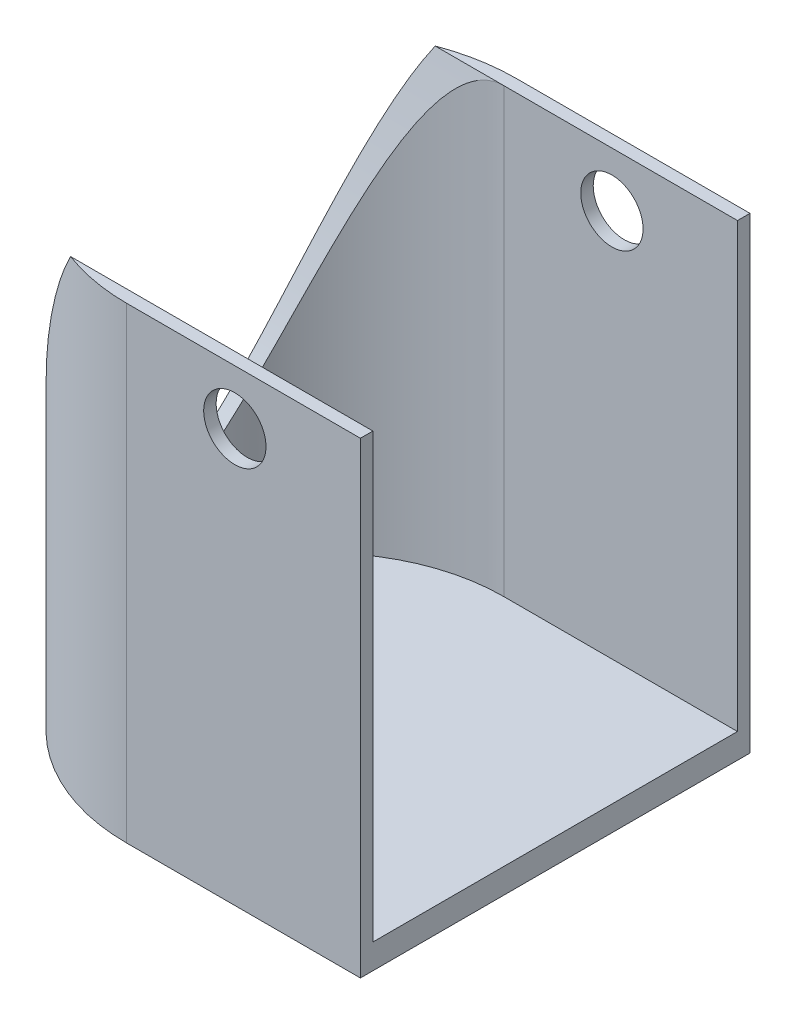
ISO-10303-21;
HEADER;
FILE_DESCRIPTION(('STEP AP214'),'2;1');
FILE_NAME('part.step','',(''),(''),'','','');
FILE_SCHEMA(('AUTOMOTIVE_DESIGN { 1 0 10303 214 1 1 1 1 }'));
ENDSEC;
DATA;
#1=APPLICATION_CONTEXT('core data for automotive mechanical design processes');
#2=APPLICATION_PROTOCOL_DEFINITION('international standard','automotive_design',2000,#1);
#3=PRODUCT_CONTEXT('',#1,'mechanical');
#4=PRODUCT('Part','Part','',(#3));
#5=PRODUCT_RELATED_PRODUCT_CATEGORY('part','',(#4));
#6=PRODUCT_DEFINITION_FORMATION('','',#4);
#7=PRODUCT_DEFINITION_CONTEXT('part definition',#1,'design');
#8=PRODUCT_DEFINITION('design','',#6,#7);
#9=PRODUCT_DEFINITION_SHAPE('','',#8);
#10=(LENGTH_UNIT() NAMED_UNIT(*) SI_UNIT(.MILLI.,.METRE.));
#11=(NAMED_UNIT(*) PLANE_ANGLE_UNIT() SI_UNIT($,.RADIAN.));
#12=(NAMED_UNIT(*) SI_UNIT($,.STERADIAN.) SOLID_ANGLE_UNIT());
#13=UNCERTAINTY_MEASURE_WITH_UNIT(LENGTH_MEASURE(1.E-05),#10,'distance_accuracy_value','');
#14=(GEOMETRIC_REPRESENTATION_CONTEXT(3) GLOBAL_UNCERTAINTY_ASSIGNED_CONTEXT((#13)) GLOBAL_UNIT_ASSIGNED_CONTEXT((#10,
#11,#12)) REPRESENTATION_CONTEXT('',''));
#15=CARTESIAN_POINT('',(0.,0.,0.));
#16=DIRECTION('',(0.,0.,1.));
#17=DIRECTION('',(1.,0.,0.));
#18=AXIS2_PLACEMENT_3D('',#15,#16,#17);
#19=CARTESIAN_POINT('',(0.,30.,0.));
#20=DIRECTION('',(0.,1.,0.));
#21=DIRECTION('',(0.,0.,1.));
#22=AXIS2_PLACEMENT_3D('',#19,#20,#21);
#23=PLANE('',#22);
#24=DIRECTION('',(1.,0.,0.));
#25=VECTOR('',#24,1.);
#26=CARTESIAN_POINT('',(-12.501,30.,11.7));
#27=LINE('',#26,#25);
#28=CARTESIAN_POINT('',(-4.40000000000001,30.,11.7));
#29=VERTEX_POINT('',#28);
#30=CARTESIAN_POINT('',(0.,30.,11.7));
#31=VERTEX_POINT('',#30);
#32=EDGE_CURVE('E111',#29,#31,#27,.T.);
#33=ORIENTED_EDGE('',*,*,#32,.F.);
#34=CARTESIAN_POINT('',(0.,30.,0.));
#35=DIRECTION('',(0.,1.,0.));
#36=DIRECTION('',(0.,0.,1.));
#37=AXIS2_PLACEMENT_3D('',#34,#35,#36);
#38=CIRCLE('',#37,12.5);
#39=CARTESIAN_POINT('',(0.,30.,12.5));
#40=VERTEX_POINT('',#39);
#41=EDGE_CURVE('E107',#29,#40,#38,.T.);
#42=ORIENTED_EDGE('',*,*,#41,.T.);
#43=DIRECTION('',(-1.,0.,0.));
#44=VECTOR('',#43,1.);
#45=CARTESIAN_POINT('',(0.,30.,12.5));
#46=LINE('',#45,#44);
#47=CARTESIAN_POINT('',(15.,30.,12.5));
#48=VERTEX_POINT('',#47);
#49=EDGE_CURVE('E108',#48,#40,#46,.T.);
#50=ORIENTED_EDGE('',*,*,#49,.F.);
#51=DIRECTION('',(0.,0.,1.));
#52=VECTOR('',#51,1.);
#53=CARTESIAN_POINT('',(15.,30.,0.));
#54=LINE('',#53,#52);
#55=CARTESIAN_POINT('',(15.,30.,11.7));
#56=VERTEX_POINT('',#55);
#57=EDGE_CURVE('E127',#56,#48,#54,.T.);
#58=ORIENTED_EDGE('',*,*,#57,.F.);
#59=DIRECTION('',(1.,0.,0.));
#60=VECTOR('',#59,1.);
#61=CARTESIAN_POINT('',(0.,30.,11.7));
#62=LINE('',#61,#60);
#63=EDGE_CURVE('E131',#31,#56,#62,.T.);
#64=ORIENTED_EDGE('',*,*,#63,.F.);
#65=EDGE_LOOP('',(#33,#42,#50,#58,#64));
#66=FACE_BOUND('',#65,.T.);
#67=ADVANCED_FACE('F40',(#66),#23,.T.);
#68=CARTESIAN_POINT('',(0.,30.,0.));
#69=DIRECTION('',(0.,-1.,0.));
#70=DIRECTION('',(0.,0.,-1.));
#71=AXIS2_PLACEMENT_3D('',#68,#69,#70);
#72=CYLINDRICAL_SURFACE('',#71,11.7);
#73=CARTESIAN_POINT('',(0.,30.,-11.7));
#74=CARTESIAN_POINT('',(-0.049258101375061,30.0000032096415,-11.7000007196841));
#75=CARTESIAN_POINT('',(-0.0985059813434851,29.9986855820141,-11.6996887822882));
#76=CARTESIAN_POINT('',(-0.196846843223026,29.9934421558597,-11.6984471842786));
#77=CARTESIAN_POINT('',(-0.24593984974552,29.9895167951369,-11.6975176273551));
#78=CARTESIAN_POINT('',(-0.392554818632999,29.9739058264299,-11.6938201805136));
#79=CARTESIAN_POINT('',(-0.489670518131584,29.9583849672015,-11.6901434315138));
#80=CARTESIAN_POINT('',(-0.679950835991783,29.9181605011221,-11.6806072739594));
#81=CARTESIAN_POINT('',(-0.773155288915134,29.893631481338,-11.6747893590142));
#82=CARTESIAN_POINT('',(-0.956861779373848,29.8362725712588,-11.6611708944151));
#83=CARTESIAN_POINT('',(-1.04736215867759,29.8034376997824,-11.6533691550083));
#84=CARTESIAN_POINT('',(-1.24723487337645,29.7214568430444,-11.6338658775857));
#85=CARTESIAN_POINT('',(-1.35572616487419,29.6702851833034,-11.6216770335838));
#86=CARTESIAN_POINT('',(-1.56745253786004,29.5585840614918,-11.595020110473));
#87=CARTESIAN_POINT('',(-1.67068615382116,29.4980520090736,-11.5805514004244));
#88=CARTESIAN_POINT('',(-1.87268693721836,29.3688928670614,-11.5496130545393));
#89=CARTESIAN_POINT('',(-1.97141579867646,29.3002096687218,-11.533129523238));
#90=CARTESIAN_POINT('',(-2.16386586291147,29.1565716069899,-11.4985757019352));
#91=CARTESIAN_POINT('',(-2.25758721748206,29.0816169338832,-11.480505460076));
#92=CARTESIAN_POINT('',(-2.43667951562796,28.9297596587419,-11.4438020372105));
#93=CARTESIAN_POINT('',(-2.52223509342245,28.8530607340774,-11.42522176038));
#94=CARTESIAN_POINT('',(-2.68945386294756,28.6957645413899,-11.3870183361033));
#95=CARTESIAN_POINT('',(-2.77111621341549,28.6151664383307,-11.3673949651816));
#96=CARTESIAN_POINT('',(-3.01088771838486,28.3684258353654,-11.3071567811458));
#97=CARTESIAN_POINT('',(-3.16367515839669,28.1974295051622,-11.2651962090944));
#98=CARTESIAN_POINT('',(-3.45759940293745,27.8461678123477,-11.1784827034435));
#99=CARTESIAN_POINT('',(-3.59872196918005,27.6658915454844,-11.1337264710326));
#100=CARTESIAN_POINT('',(-3.87105257915507,27.2987280974535,-11.0419915153588));
#101=CARTESIAN_POINT('',(-4.00226552206157,27.111844250966,-10.99501390924));
#102=CARTESIAN_POINT('',(-4.24636675041821,26.7479840105599,-10.9029353840585));
#103=CARTESIAN_POINT('',(-4.35988395533909,26.5713898674332,-10.857978997491));
#104=CARTESIAN_POINT('',(-4.58085936151995,26.2148026735703,-10.7666160032948));
#105=CARTESIAN_POINT('',(-4.68831690346248,26.0348092558118,-10.7202092387092));
#106=CARTESIAN_POINT('',(-4.89807040969365,25.6718934099229,-10.6260124012262));
#107=CARTESIAN_POINT('',(-5.00035981577591,25.4889676299519,-10.5782206861051));
#108=CARTESIAN_POINT('',(-5.20027244128587,25.1209051704081,-10.4813876093092));
#109=CARTESIAN_POINT('',(-5.29789539286179,24.9357683646842,-10.4323461761485));
#110=CARTESIAN_POINT('',(-5.58486268304371,24.3771000226047,-10.2832843701603));
#111=CARTESIAN_POINT('',(-5.76799734103882,24.0008520005404,-10.1814667251662));
#112=CARTESIAN_POINT('',(-6.12099546442225,23.2433562094264,-9.97323123906766));
#113=CARTESIAN_POINT('',(-6.29085501098016,22.8621070025187,-9.86681205387523));
#114=CARTESIAN_POINT('',(-6.62017024833715,22.0947441124164,-9.64896175256481));
#115=CARTESIAN_POINT('',(-6.77958401804471,21.7086174606204,-9.53751315164774));
#116=CARTESIAN_POINT('',(-7.08883568455921,20.9345191389043,-9.3099517985175));
#117=CARTESIAN_POINT('',(-7.2386851374114,20.5465503282807,-9.19384496198414));
#118=CARTESIAN_POINT('',(-7.53023621352857,19.7693820390032,-8.95660853508552));
#119=CARTESIAN_POINT('',(-7.67194264355999,19.3801834324663,-8.83548198204322));
#120=CARTESIAN_POINT('',(-7.94829091353698,18.6010828379043,-8.5877296513818));
#121=CARTESIAN_POINT('',(-8.08293348929008,18.2111809275329,-8.46110444905181));
#122=CARTESIAN_POINT('',(-8.35038890203282,17.4181185727428,-8.1974055179718));
#123=CARTESIAN_POINT('',(-8.48298656385961,17.0149548414438,-8.06012337587082));
#124=CARTESIAN_POINT('',(-8.74218586861357,16.2091222281368,-7.77822990581555));
#125=CARTESIAN_POINT('',(-8.86878582998974,15.8064535153777,-7.63361654568778));
#126=CARTESIAN_POINT('',(-9.11649011376761,15.0023763540498,-7.3360143526935));
#127=CARTESIAN_POINT('',(-9.23759287465805,14.6009682933444,-7.18302316695098));
#128=CARTESIAN_POINT('',(-9.47446179073551,13.8009841668016,-6.86756437349363));
#129=CARTESIAN_POINT('',(-9.59023510885834,13.4024049472532,-6.70511019209105));
#130=CARTESIAN_POINT('',(-9.81681100047771,12.6087686979649,-6.36877833837085));
#131=CARTESIAN_POINT('',(-9.92761474456836,12.2137108565112,-6.19490338027734));
#132=CARTESIAN_POINT('',(-10.1442936359354,11.4287378924248,-5.83333397657197));
#133=CARTESIAN_POINT('',(-10.250170683847,11.0388208288773,-5.64564493356475));
#134=CARTESIAN_POINT('',(-10.431393656897,10.3615256462058,-5.30131447028419));
#135=CARTESIAN_POINT('',(-10.5078369197916,10.0725442761388,-5.1484107529375));
#136=CARTESIAN_POINT('',(-10.657659635622,9.50020419245309,-4.83065511595258));
#137=CARTESIAN_POINT('',(-10.7310380503971,9.2168474008406,-4.66579919863674));
#138=CARTESIAN_POINT('',(-10.8383619742498,8.7983397017282,-4.40777846867556));
#139=CARTESIAN_POINT('',(-10.8736289768821,8.66012551701851,-4.320120206107));
#140=CARTESIAN_POINT('',(-10.9432086893224,8.38614344205187,-4.14070683655348));
#141=CARTESIAN_POINT('',(-10.977521477517,8.25037535117805,-4.04895206771083));
#142=CARTESIAN_POINT('',(-11.0450704312391,7.98188127151324,-3.86088014450412));
#143=CARTESIAN_POINT('',(-11.0783072342264,7.8491534956639,-3.7645657779291));
#144=CARTESIAN_POINT('',(-11.1435800333868,7.58735877432487,-3.56671830245641));
#145=CARTESIAN_POINT('',(-11.1756162468655,7.4582911673873,-3.46518614593951));
#146=CARTESIAN_POINT('',(-11.2306276426555,7.23574642945223,-3.28173550481671));
#147=CARTESIAN_POINT('',(-11.2539017651121,7.14128874290048,-3.2010972285925));
#148=CARTESIAN_POINT('',(-11.2995459699265,6.95548859794716,-3.03604917524168));
#149=CARTESIAN_POINT('',(-11.3219160562565,6.86414612585846,-2.9516394146894));
#150=CARTESIAN_POINT('',(-11.3656570575082,6.68503473178586,-2.77845886083546));
#151=CARTESIAN_POINT('',(-11.3870257315241,6.59727387635499,-2.68967912063535));
#152=CARTESIAN_POINT('',(-11.4285282301928,6.42636971224671,-2.50748331861749));
#153=CARTESIAN_POINT('',(-11.4486620598057,6.34322638502207,-2.41406727542525));
#154=CARTESIAN_POINT('',(-11.4877078309611,6.18158917615351,-2.22090175027632));
#155=CARTESIAN_POINT('',(-11.5066005910373,6.10316937607054,-2.12108595789139));
#156=CARTESIAN_POINT('',(-11.5425595899119,5.95357682934364,-1.91577110572283));
#157=CARTESIAN_POINT('',(-11.5596254448091,5.88240560604923,-1.81027085839701));
#158=CARTESIAN_POINT('',(-11.5914670569171,5.74935564413245,-1.59368509182712));
#159=CARTESIAN_POINT('',(-11.6062503426427,5.68744637907462,-1.48261960671381));
#160=CARTESIAN_POINT('',(-11.6330997473687,5.57482897509669,-1.25464315762301));
#161=CARTESIAN_POINT('',(-11.6451680629683,5.52411178165185,-1.13773701342089));
#162=CARTESIAN_POINT('',(-11.6621306780571,5.45274354300543,-0.943572077344231));
#163=CARTESIAN_POINT('',(-11.6680171765049,5.42795383250219,-0.86790971874309));
#164=CARTESIAN_POINT('',(-11.6783945768847,5.38422621773212,-0.714827860662595));
#165=CARTESIAN_POINT('',(-11.6828859463492,5.36528635309056,-0.637408959184661));
#166=CARTESIAN_POINT('',(-11.6903580181322,5.33376484284114,-0.481280713220115));
#167=CARTESIAN_POINT('',(-11.6933400817223,5.32117746783182,-0.402572597894574));
#168=CARTESIAN_POINT('',(-11.6977164716923,5.30270126484983,-0.244322536513957));
#169=CARTESIAN_POINT('',(-11.6991107769746,5.29681252588567,-0.164780579393334));
#170=CARTESIAN_POINT('',(-11.700271534706,5.29191030773773,-0.00524142583990026));
#171=CARTESIAN_POINT('',(-11.7000332768325,5.2929167226681,0.0747564219071852));
#172=CARTESIAN_POINT('',(-11.6979251499843,5.30181941745877,0.234341389358526));
#173=CARTESIAN_POINT('',(-11.6960553066526,5.30971558903559,0.313928515498149));
#174=CARTESIAN_POINT('',(-11.6907374097818,5.33216254806434,0.472154458845774));
#175=CARTESIAN_POINT('',(-11.6872882761399,5.34671788982755,0.550792589180831));
#176=CARTESIAN_POINT('',(-11.6789045225227,5.38207472582118,0.706599195949387));
#177=CARTESIAN_POINT('',(-11.6739691324941,5.40287945794697,0.783766888434809));
#178=CARTESIAN_POINT('',(-11.6611043399576,5.45706576438037,0.958310748303037));
#179=CARTESIAN_POINT('',(-11.6527217844705,5.49234477275533,1.05506573778316));
#180=CARTESIAN_POINT('',(-11.6339673803353,5.57116868060561,1.24495768691491));
#181=CARTESIAN_POINT('',(-11.6235945465596,5.61471767336269,1.33809282728237));
#182=CARTESIAN_POINT('',(-11.601123443178,5.70891144220395,1.52066115453911));
#183=CARTESIAN_POINT('',(-11.5890222894493,5.75956807658215,1.61008782444147));
#184=CARTESIAN_POINT('',(-11.5633631649667,5.86679043998052,1.78506280119763));
#185=CARTESIAN_POINT('',(-11.5498053063613,5.92335571409826,1.87061140589507));
#186=CARTESIAN_POINT('',(-11.5104672717437,6.08716148907908,2.10282238760349));
#187=CARTESIAN_POINT('',(-11.4833523222947,6.19972461850636,2.24551138751755));
#188=CARTESIAN_POINT('',(-11.4261507462943,6.43624717575431,2.52047950279845));
#189=CARTESIAN_POINT('',(-11.3960615518666,6.56021644480067,2.65274944248283));
#190=CARTESIAN_POINT('',(-11.3334849644712,6.81693169282609,2.90851976753572));
#191=CARTESIAN_POINT('',(-11.3009914629996,6.94969993104013,3.03199613449709));
#192=CARTESIAN_POINT('',(-11.2341397383921,7.22160672467123,3.27100804932282));
#193=CARTESIAN_POINT('',(-11.1997822502445,7.36074276586433,3.38654668696526));
#194=CARTESIAN_POINT('',(-11.1360015336267,7.61778938533407,3.59007424501468));
#195=CARTESIAN_POINT('',(-11.1068409351137,7.73486636540307,3.679206368055));
#196=CARTESIAN_POINT('',(-11.0475976965937,7.97175661546727,3.85344581519432));
#197=CARTESIAN_POINT('',(-11.0175149795787,8.09157011378059,3.93855280162837));
#198=CARTESIAN_POINT('',(-10.9259603122042,8.45467863928166,4.18867744687654));
#199=CARTESIAN_POINT('',(-10.8632456780835,8.7013840661726,4.34829852262194));
#200=CARTESIAN_POINT('',(-10.7349342636131,9.20157174127461,4.65606836864015));
#201=CARTESIAN_POINT('',(-10.6693332855075,9.45506363468299,4.80419950189019));
#202=CARTESIAN_POINT('',(-10.5356044072976,9.96687500824878,5.09077990391465));
#203=CARTESIAN_POINT('',(-10.4674758725367,10.2251956927013,5.22922671547818));
#204=CARTESIAN_POINT('',(-10.3284994779328,10.7468416360025,5.49865330693726));
#205=CARTESIAN_POINT('',(-10.2576388395073,11.0101864768967,5.62958836167974));
#206=CARTESIAN_POINT('',(-10.1137194531307,11.5393439411996,5.88421906068544));
#207=CARTESIAN_POINT('',(-10.0406633876232,11.8051532989907,6.00792303585696));
#208=CARTESIAN_POINT('',(-9.8923409960964,12.3387659184069,6.24912947482098));
#209=CARTESIAN_POINT('',(-9.81707590092932,12.6065680098533,6.36663529377576));
#210=CARTESIAN_POINT('',(-9.66428964517458,13.1437862252259,6.59625005095989));
#211=CARTESIAN_POINT('',(-9.58676878849577,13.413202127882,6.70835971083789));
#212=CARTESIAN_POINT('',(-9.4269932970419,13.9615817940221,6.93117359382533));
#213=CARTESIAN_POINT('',(-9.34466639758636,14.2405848459802,7.04172911560225));
#214=CARTESIAN_POINT('',(-9.17745197127813,14.7995825582558,7.25831043432132));
#215=CARTESIAN_POINT('',(-9.09256438363781,15.079577241974,7.3643361235861));
#216=CARTESIAN_POINT('',(-8.83379601813817,15.9208629874757,7.67640984754736));
#217=CARTESIAN_POINT('',(-8.65588565316495,16.4831935061923,7.87634912995903));
#218=CARTESIAN_POINT('',(-8.28782902928587,17.6087668788896,8.26275037122836));
#219=CARTESIAN_POINT('',(-8.09767723112137,18.1720100318567,8.44920614660237));
#220=CARTESIAN_POINT('',(-7.70417866660093,19.2942391867715,8.80945403930699));
#221=CARTESIAN_POINT('',(-7.50090879127024,19.8532317419639,8.98330916854054));
#222=CARTESIAN_POINT('',(-7.18323088357998,20.6890697215017,9.23631053299985));
#223=CARTESIAN_POINT('',(-7.07523056064209,20.967189362029,9.31933279209121));
#224=CARTESIAN_POINT('',(-6.85445439951712,21.5222568294438,9.48289784446998));
#225=CARTESIAN_POINT('',(-6.74167868979394,21.7992046876335,9.5634407043558));
#226=CARTESIAN_POINT('',(-6.51080956350313,22.3514200220284,9.72208638472129));
#227=CARTESIAN_POINT('',(-6.39271864764165,22.6266882206694,9.8001903239686));
#228=CARTESIAN_POINT('',(-6.15043836038742,23.175186294546,9.95402978907956));
#229=CARTESIAN_POINT('',(-6.02624931369776,23.4484162774186,10.0297654406951));
#230=CARTESIAN_POINT('',(-5.7943957513665,23.9420823796381,10.1651125666011));
#231=CARTESIAN_POINT('',(-5.68790781051858,24.1629615513849,10.2251217283439));
#232=CARTESIAN_POINT('',(-5.46962580131675,24.60253968615,10.3435302377273));
#233=CARTESIAN_POINT('',(-5.3578315036511,24.8212385544523,10.4019295156248));
#234=CARTESIAN_POINT('',(-5.12785104289169,25.2564991534525,10.5172115202566));
#235=CARTESIAN_POINT('',(-5.00964769252403,25.4730530882379,10.5740894894756));
#236=CARTESIAN_POINT('',(-4.76618302284153,25.9026313674325,10.6860406564638));
#237=CARTESIAN_POINT('',(-4.64092226004046,26.115655988437,10.7411139959972));
#238=CARTESIAN_POINT('',(-4.41923027346935,26.4766853486969,10.8337617937533));
#239=CARTESIAN_POINT('',(-4.32483493521446,26.6258143246829,10.8718245982215));
#240=CARTESIAN_POINT('',(-4.13125980836975,26.9212553844865,10.9468477190659));
#241=CARTESIAN_POINT('',(-4.03207946250393,27.0675671374123,10.9838079062127));
#242=CARTESIAN_POINT('',(-3.82822461016261,27.3567766642691,11.0565101471342));
#243=CARTESIAN_POINT('',(-3.72354678567304,27.4996722989027,11.0922514432762));
#244=CARTESIAN_POINT('',(-3.50833308884625,27.7805700463197,11.1621843754375));
#245=CARTESIAN_POINT('',(-3.39781915196535,27.9185876244501,11.196381026979));
#246=CARTESIAN_POINT('',(-3.16970794027035,28.1889803319749,11.2630844139328));
#247=CARTESIAN_POINT('',(-3.05211407173584,28.3213581232406,11.2955919482036));
#248=CARTESIAN_POINT('',(-2.80878501631485,28.5787554612646,11.3585436979105));
#249=CARTESIAN_POINT('',(-2.68305842282783,28.7037825167747,11.388990023857));
#250=CARTESIAN_POINT('',(-2.47381549425576,28.8965760765342,11.4357657449421));
#251=CARTESIAN_POINT('',(-2.39330409948314,28.9674084141138,11.4529102310276));
#252=CARTESIAN_POINT('',(-2.22852694413615,29.1048650586511,11.4861106243779));
#253=CARTESIAN_POINT('',(-2.14426103003526,29.1714891932607,11.5021664870598));
#254=CARTESIAN_POINT('',(-1.97170751707679,29.2996730917239,11.5329979994328));
#255=CARTESIAN_POINT('',(-1.88342006873105,29.3612330448702,11.547773696976));
#256=CARTESIAN_POINT('',(-1.70268446624892,29.4782187520015,11.5758041892066));
#257=CARTESIAN_POINT('',(-1.61023712235287,29.5336456933264,11.5890592782994));
#258=CARTESIAN_POINT('',(-1.35845366006451,29.6713713475091,11.6219463807737));
#259=CARTESIAN_POINT('',(-1.19522506768869,29.7472748423994,11.6400164634366));
#260=CARTESIAN_POINT('',(-0.942794837172334,29.840848709109,11.6622583577748));
#261=CARTESIAN_POINT('',(-0.857485855105807,29.8686401068847,11.6688571421114));
#262=CARTESIAN_POINT('',(-0.684678705473645,29.9167356736402,11.6802697896951));
#263=CARTESIAN_POINT('',(-0.597181741676468,29.937043866937,11.6850846123287));
#264=CARTESIAN_POINT('',(-0.425147171244462,29.9686393104845,11.6925728025152));
#265=CARTESIAN_POINT('',(-0.340689659647246,29.9803377778082,11.6953438038468));
#266=CARTESIAN_POINT('',(-0.170832762878414,29.9960494988495,11.6990646122625));
#267=CARTESIAN_POINT('',(-0.0854316676309858,30.00004514655,11.7000102471884));
#268=CARTESIAN_POINT('',(0.,30.,11.7));
#269=B_SPLINE_CURVE_WITH_KNOTS('',3,(#73,#74,#75,#76,#77,#78,#79,#80,#81,#82,#83,#84,#85,#86,
#87,#88,#89,#90,#91,#92,#93,#94,#95,#96,#97,#98,#99,#100,#101,#102,#103,#104,#105,#106,#107,
#108,#109,#110,#111,#112,#113,#114,#115,#116,#117,#118,#119,#120,#121,#122,#123,#124,#125,#126,
#127,#128,#129,#130,#131,#132,#133,#134,#135,#136,#137,#138,#139,#140,#141,#142,#143,#144,#145,
#146,#147,#148,#149,#150,#151,#152,#153,#154,#155,#156,#157,#158,#159,#160,#161,#162,#163,#164,
#165,#166,#167,#168,#169,#170,#171,#172,#173,#174,#175,#176,#177,#178,#179,#180,#181,#182,#183,
#184,#185,#186,#187,#188,#189,#190,#191,#192,#193,#194,#195,#196,#197,#198,#199,#200,#201,#202,
#203,#204,#205,#206,#207,#208,#209,#210,#211,#212,#213,#214,#215,#216,#217,#218,#219,#220,#221,
#222,#223,#224,#225,#226,#227,#228,#229,#230,#231,#232,#233,#234,#235,#236,#237,#238,#239,#240,
#241,#242,#243,#244,#245,#246,#247,#248,#249,#250,#251,#252,#253,#254,#255,#256,#257,#258,#259,
#260,#261,#262,#263,#264,#265,#266,#267,#268),.UNSPECIFIED.,.F.,.F.,(4,2,2,2,2,2,2,2,2,2,2,2,2,
2,2,2,2,2,2,2,2,2,2,2,2,2,2,2,2,2,2,2,2,2,2,2,2,2,2,2,2,2,2,2,2,2,2,2,2,2,2,2,2,2,2,2,2,2,2,2,2,
2,2,2,2,2,2,2,2,2,2,2,2,2,2,2,2,2,2,2,2,2,2,2,2,2,2,2,2,2,2,2,2,2,2,2,2,4),(0.,
0.147735930793361,0.295447064933373,0.590100099751862,0.879320349173426,1.16871446255305,
1.52982437254887,1.89103439370007,2.25489330933854,2.61874118897418,2.96776984030671,
3.31687357231839,4.01550716530005,4.71498129916086,5.41410732814498,6.05805241163673,
6.7020674244779,7.34688014071011,7.9917298244831,9.28334307701459,10.5753361864835,
11.8722315410463,13.1675290454141,14.4620539203642,15.756443682094,17.0945256385947,
18.4329805540686,19.7718133161346,21.1087907134766,22.4454515108537,23.7815922980353,
24.788667231705,25.7960805717865,26.2982975817835,26.8004732131102,27.3023456770809,
27.8041268595494,28.1831201464066,28.5621117678885,28.9419145121045,29.3217157306549,
29.7064313489694,30.0912276524,30.4747263606356,30.8579136668904,31.0972124006623,
31.3364308544635,31.5754331663949,31.8144386540464,32.0541340176342,32.2938256140959,
32.5336813850323,32.7736616435348,33.0831562525449,33.3928044490543,33.7029755410638,
34.0131227707745,34.5634340289459,35.1142246300775,35.6664661136153,36.2184914035617,
36.6684216198753,37.1183895137069,38.0193211349545,38.9216093861973,39.8241257515199,
40.7315525462365,41.6379124110573,42.5437765046646,43.4495191151364,44.3830562412301,
45.3166155458382,47.1846117629917,49.0534592735324,50.9122035650255,51.8412320114178,
52.7702354816362,53.6988063506305,54.6273278301352,55.3846028841931,56.1419106933866,
56.9013608479119,57.6607511994218,58.2023313039102,58.7439746353826,59.2859487202065,
59.82601356658,60.3658206230523,60.9050663291821,61.2307306863929,61.5564083726299,
61.8820738798997,62.2076762281967,62.7480819233747,63.0176863074101,63.2871454912861,
63.5427080438606,63.7988540358683),.UNSPECIFIED.);
#270=CARTESIAN_POINT('',(0.,30.,-11.7));
#271=VERTEX_POINT('',#270);
#272=EDGE_CURVE('E90',#271,#31,#269,.T.);
#273=ORIENTED_EDGE('',*,*,#272,.T.);
#274=DIRECTION('',(0.,-1.,0.));
#275=VECTOR('',#274,1.);
#276=CARTESIAN_POINT('',(0.,30.,11.7));
#277=LINE('',#276,#275);
#278=CARTESIAN_POINT('',(0.,1.6,11.7));
#279=VERTEX_POINT('',#278);
#280=EDGE_CURVE('E140',#31,#279,#277,.T.);
#281=ORIENTED_EDGE('',*,*,#280,.T.);
#282=CARTESIAN_POINT('',(0.,1.6,0.));
#283=DIRECTION('',(0.,1.,0.));
#284=DIRECTION('',(0.,0.,1.));
#285=AXIS2_PLACEMENT_3D('',#282,#283,#284);
#286=CIRCLE('',#285,11.7);
#287=CARTESIAN_POINT('',(0.,1.6,-11.7));
#288=VERTEX_POINT('',#287);
#289=EDGE_CURVE('E189',#288,#279,#286,.T.);
#290=ORIENTED_EDGE('',*,*,#289,.F.);
#291=DIRECTION('',(0.,-1.,0.));
#292=VECTOR('',#291,1.);
#293=CARTESIAN_POINT('',(0.,30.,-11.7));
#294=LINE('',#293,#292);
#295=EDGE_CURVE('E11',#271,#288,#294,.T.);
#296=ORIENTED_EDGE('',*,*,#295,.F.);
#297=EDGE_LOOP('',(#273,#281,#290,#296));
#298=FACE_BOUND('',#297,.T.);
#299=ADVANCED_FACE('F42',(#298),#72,.F.);
#300=CARTESIAN_POINT('',(0.,30.,-11.7));
#301=DIRECTION('',(0.,0.,-1.));
#302=DIRECTION('',(-1.,0.,0.));
#303=AXIS2_PLACEMENT_3D('',#300,#301,#302);
#304=PLANE('',#303);
#305=CARTESIAN_POINT('',(6.94096240496907,26.5006447804901,-11.7));
#306=DIRECTION('',(0.,0.,-1.));
#307=DIRECTION('',(-1.,0.,0.));
#308=AXIS2_PLACEMENT_3D('',#305,#306,#307);
#309=CIRCLE('',#308,2.);
#310=CARTESIAN_POINT('',(4.94096240496907,26.5006447804901,-11.7));
#311=VERTEX_POINT('',#310);
#312=EDGE_CURVE('E308',#311,#311,#309,.T.);
#313=ORIENTED_EDGE('',*,*,#312,.T.);
#314=EDGE_LOOP('',(#313));
#315=FACE_BOUND('',#314,.T.);
#316=ORIENTED_EDGE('',*,*,#295,.T.);
#317=DIRECTION('',(1.,0.,0.));
#318=VECTOR('',#317,1.);
#319=CARTESIAN_POINT('',(0.,1.6,-11.7));
#320=LINE('',#319,#318);
#321=CARTESIAN_POINT('',(15.,1.6,-11.7));
#322=VERTEX_POINT('',#321);
#323=EDGE_CURVE('E182',#288,#322,#320,.T.);
#324=ORIENTED_EDGE('',*,*,#323,.T.);
#325=DIRECTION('',(0.,-1.,0.));
#326=VECTOR('',#325,1.);
#327=CARTESIAN_POINT('',(15.,30.,-11.7));
#328=LINE('',#327,#326);
#329=CARTESIAN_POINT('',(15.,30.,-11.7));
#330=VERTEX_POINT('',#329);
#331=EDGE_CURVE('E51',#330,#322,#328,.T.);
#332=ORIENTED_EDGE('',*,*,#331,.F.);
#333=DIRECTION('',(1.,0.,0.));
#334=VECTOR('',#333,1.);
#335=CARTESIAN_POINT('',(0.,30.,-11.7));
#336=LINE('',#335,#334);
#337=EDGE_CURVE('E145',#271,#330,#336,.T.);
#338=ORIENTED_EDGE('',*,*,#337,.F.);
#339=EDGE_LOOP('',(#316,#324,#332,#338));
#340=FACE_BOUND('',#339,.T.);
#341=ADVANCED_FACE('F180',(#315,#340),#304,.F.);
#342=CARTESIAN_POINT('',(0.,30.,-12.5));
#343=DIRECTION('',(0.,0.,-1.));
#344=DIRECTION('',(-1.,0.,0.));
#345=AXIS2_PLACEMENT_3D('',#342,#343,#344);
#346=PLANE('',#345);
#347=CARTESIAN_POINT('',(6.94096240496907,26.5006447804901,-12.5));
#348=DIRECTION('',(0.,0.,-1.));
#349=DIRECTION('',(-1.,0.,0.));
#350=AXIS2_PLACEMENT_3D('',#347,#348,#349);
#351=CIRCLE('',#350,2.);
#352=CARTESIAN_POINT('',(4.94096240496907,26.5006447804901,-12.5));
#353=VERTEX_POINT('',#352);
#354=EDGE_CURVE('E312',#353,#353,#351,.T.);
#355=ORIENTED_EDGE('',*,*,#354,.F.);
#356=EDGE_LOOP('',(#355));
#357=FACE_BOUND('',#356,.T.);
#358=DIRECTION('',(1.,0.,0.));
#359=VECTOR('',#358,1.);
#360=CARTESIAN_POINT('',(0.,0.,-12.5));
#361=LINE('',#360,#359);
#362=CARTESIAN_POINT('',(0.,0.,-12.5));
#363=VERTEX_POINT('',#362);
#364=CARTESIAN_POINT('',(15.,0.,-12.5));
#365=VERTEX_POINT('',#364);
#366=EDGE_CURVE('E147',#363,#365,#361,.T.);
#367=ORIENTED_EDGE('',*,*,#366,.F.);
#368=DIRECTION('',(0.,-1.,0.));
#369=VECTOR('',#368,1.);
#370=CARTESIAN_POINT('',(0.,30.,-12.5));
#371=LINE('',#370,#369);
#372=CARTESIAN_POINT('',(0.,30.,-12.5));
#373=VERTEX_POINT('',#372);
#374=EDGE_CURVE('E123',#373,#363,#371,.T.);
#375=ORIENTED_EDGE('',*,*,#374,.F.);
#376=DIRECTION('',(1.,0.,0.));
#377=VECTOR('',#376,1.);
#378=CARTESIAN_POINT('',(0.,30.,-12.5));
#379=LINE('',#378,#377);
#380=CARTESIAN_POINT('',(15.,30.,-12.5));
#381=VERTEX_POINT('',#380);
#382=EDGE_CURVE('E116',#373,#381,#379,.T.);
#383=ORIENTED_EDGE('',*,*,#382,.T.);
#384=DIRECTION('',(0.,-1.,0.));
#385=VECTOR('',#384,1.);
#386=CARTESIAN_POINT('',(15.,30.,-12.5));
#387=LINE('',#386,#385);
#388=EDGE_CURVE('E165',#381,#365,#387,.T.);
#389=ORIENTED_EDGE('',*,*,#388,.T.);
#390=EDGE_LOOP('',(#367,#375,#383,#389));
#391=FACE_BOUND('',#390,.T.);
#392=ADVANCED_FACE('F211',(#357,#391),#346,.T.);
#393=CARTESIAN_POINT('',(0.,30.,0.));
#394=DIRECTION('',(0.,-1.,0.));
#395=DIRECTION('',(0.,0.,-1.));
#396=AXIS2_PLACEMENT_3D('',#393,#394,#395);
#397=CYLINDRICAL_SURFACE('',#396,12.5);
#398=ORIENTED_EDGE('',*,*,#41,.F.);
#399=CARTESIAN_POINT('',(-4.40000000000001,30.,-11.7));
#400=CARTESIAN_POINT('',(-4.46298257682274,29.8999582425929,-11.6763126161015));
#401=CARTESIAN_POINT('',(-4.52497861415982,29.7993503456691,-11.652419129066));
#402=CARTESIAN_POINT('',(-4.6471363219298,29.5971269918226,-11.6042424456272));
#403=CARTESIAN_POINT('',(-4.70729809846142,29.4955115936289,-11.579959271889));
#404=CARTESIAN_POINT('',(-4.88521501384227,29.1893853571188,-11.5065695871052));
#405=CARTESIAN_POINT('',(-5.00043961057505,28.9835339033756,-11.4569085786751));
#406=CARTESIAN_POINT('',(-5.2246090974034,28.569810865162,-11.3564291689703));
#407=CARTESIAN_POINT('',(-5.33357656431099,28.3619501816507,-11.3056159905895));
#408=CARTESIAN_POINT('',(-5.54643958952085,27.9439429811534,-11.2027213200459));
#409=CARTESIAN_POINT('',(-5.65033472120037,27.7337962737064,-11.1506397217495));
#410=CARTESIAN_POINT('',(-5.9550283970794,27.1011863678424,-10.9927273992857));
#411=CARTESIAN_POINT('',(-6.14915381004279,26.6759559762845,-10.8850843435928));
#412=CARTESIAN_POINT('',(-6.52309863518384,25.8206360591102,-10.6651828941551));
#413=CARTESIAN_POINT('',(-6.70292187452981,25.390547868828,-10.5529257473895));
#414=CARTESIAN_POINT('',(-7.05085011174573,24.5268532126851,-10.323706072612));
#415=CARTESIAN_POINT('',(-7.21895374019016,24.0932463422565,-10.2067429972266));
#416=CARTESIAN_POINT('',(-7.54588727060937,23.2220396872199,-9.96748487833718));
#417=CARTESIAN_POINT('',(-7.70467986086993,22.784431014852,-9.84517141236492));
#418=CARTESIAN_POINT('',(-8.0137927840493,21.9074815557329,-9.59524056149024));
#419=CARTESIAN_POINT('',(-8.16410883989849,21.4681400121401,-9.46762055446063));
#420=CARTESIAN_POINT('',(-8.45731841596611,20.5885221793239,-9.20664398204114));
#421=CARTESIAN_POINT('',(-8.60020958210823,20.1482456391564,-9.07328562149905));
#422=CARTESIAN_POINT('',(-8.87937614979075,19.2675158652628,-8.80027257604898));
#423=CARTESIAN_POINT('',(-9.01565114541832,18.8270626223631,-8.66061750583885));
#424=CARTESIAN_POINT('',(-9.28221379603476,17.9467269363642,-8.37429190347375));
#425=CARTESIAN_POINT('',(-9.4125026372669,17.5068443971076,-8.22762277311582));
#426=CARTESIAN_POINT('',(-9.65720443041741,16.6641559494845,-7.93859304784469));
#427=CARTESIAN_POINT('',(-9.77204449653341,16.2612588615064,-7.79686047003266));
#428=CARTESIAN_POINT('',(-9.99740907490044,15.457125126436,-7.50571138847189));
#429=CARTESIAN_POINT('',(-10.1079344233331,15.0558881712244,-7.35629638669382));
#430=CARTESIAN_POINT('',(-10.3249308491156,14.2556319674153,-7.04849506500359));
#431=CARTESIAN_POINT('',(-10.4314009170319,13.8566132918262,-6.89010653550774));
#432=CARTESIAN_POINT('',(-10.6403745581772,13.0618458107731,-6.5627845412445));
#433=CARTESIAN_POINT('',(-10.7428779973572,12.6660971161702,-6.39385072061109));
#434=CARTESIAN_POINT('',(-10.9439022870246,11.8792467226266,-6.04333388341302));
#435=CARTESIAN_POINT('',(-11.0424238004849,11.4881442578293,-5.86175298635456));
#436=CARTESIAN_POINT('',(-11.1870701359382,10.9065426624448,-5.57769632690182));
#437=CARTESIAN_POINT('',(-11.2347525652148,10.7135602681186,-5.48108623661578));
#438=CARTESIAN_POINT('',(-11.3290341889278,10.3295998047023,-5.28346332721676));
#439=CARTESIAN_POINT('',(-11.3756334337042,10.1386216426944,-5.18245071333675));
#440=CARTESIAN_POINT('',(-11.4679411554678,9.75804285179762,-4.97486686496891));
#441=CARTESIAN_POINT('',(-11.5136432398509,9.56845578428678,-4.86826784915053));
#442=CARTESIAN_POINT('',(-11.6037971082424,9.19229682894528,-4.64929232948798));
#443=CARTESIAN_POINT('',(-11.6482487191363,9.00572536009777,-4.53691503173375));
#444=CARTESIAN_POINT('',(-11.7357848816789,8.63627695129893,-4.30542473617856));
#445=CARTESIAN_POINT('',(-11.7788684719256,8.45340264101008,-4.18630715821838));
#446=CARTESIAN_POINT('',(-11.8634349658226,8.09254521045733,-3.94028426489357));
#447=CARTESIAN_POINT('',(-11.9049178038418,7.91456229082735,-3.81337863076851));
#448=CARTESIAN_POINT('',(-11.9859590316327,7.56511157392176,-3.55045216760833));
#449=CARTESIAN_POINT('',(-12.0255184053721,7.39364045551124,-3.41443608561835));
#450=CARTESIAN_POINT('',(-12.1022522406632,7.05948146450787,-3.13160727058742));
#451=CARTESIAN_POINT('',(-12.1394291746486,6.8967845150449,-2.98480608124183));
#452=CARTESIAN_POINT('',(-12.2022230954404,6.6208119380346,-2.71478976227325));
#453=CARTESIAN_POINT('',(-12.2284803674726,6.50501327299232,-2.59431517929848));
#454=CARTESIAN_POINT('',(-12.2787961673635,6.28245325887126,-2.34465200558906));
#455=CARTESIAN_POINT('',(-12.3028536193758,6.17569633361909,-2.21545920422471));
#456=CARTESIAN_POINT('',(-12.3479640582127,5.97499120428769,-1.94833577064592));
#457=CARTESIAN_POINT('',(-12.369036908775,5.88095852233885,-1.81047267835906));
#458=CARTESIAN_POINT('',(-12.4075052284308,5.7089335601292,-1.52463750876078));
#459=CARTESIAN_POINT('',(-12.4249066011462,5.63091553436297,-1.37668217439737));
#460=CARTESIAN_POINT('',(-12.4472981218657,5.53036645123673,-1.14909713911633));
#461=CARTESIAN_POINT('',(-12.4540896113542,5.49983984555294,-1.07313989410869));
#462=CARTESIAN_POINT('',(-12.4664035849,5.44445354882847,-0.919099765296586));
#463=CARTESIAN_POINT('',(-12.471926600231,5.41959148534758,-0.841017786774761));
#464=CARTESIAN_POINT('',(-12.4815726908072,5.37614749139041,-0.683079695494702));
#465=CARTESIAN_POINT('',(-12.4856965751211,5.35756193145952,-0.60322463661143));
#466=CARTESIAN_POINT('',(-12.4924372640485,5.32717329175513,-0.442160418048462));
#467=CARTESIAN_POINT('',(-12.4950540609979,5.31537024647354,-0.360951251484726));
#468=CARTESIAN_POINT('',(-12.4987119860065,5.29886913923302,-0.197313005364919));
#469=CARTESIAN_POINT('',(-12.4997442128191,5.29421121475381,-0.114879641898388));
#470=CARTESIAN_POINT('',(-12.5001717964123,5.29228188445195,0.0500758505130436));
#471=CARTESIAN_POINT('',(-12.4995671984442,5.29501027442919,0.132597976940981));
#472=CARTESIAN_POINT('',(-12.4967397134501,5.30776652444939,0.297100487001558));
#473=CARTESIAN_POINT('',(-12.4945157313601,5.31779932389792,0.379080466149236));
#474=CARTESIAN_POINT('',(-12.4885173919622,5.3448465717394,0.541819072329256));
#475=CARTESIAN_POINT('',(-12.4847428532137,5.3618618371954,0.622577555279416));
#476=CARTESIAN_POINT('',(-12.4749508767458,5.40597524103373,0.796538052720592));
#477=CARTESIAN_POINT('',(-12.4686543944806,5.43432633749367,0.889407060914399));
#478=CARTESIAN_POINT('',(-12.454272730482,5.49901910240944,1.07214934382275));
#479=CARTESIAN_POINT('',(-12.4461871699047,5.53536246324704,1.16202197939923));
#480=CARTESIAN_POINT('',(-12.4195647860728,5.65488472504975,1.42684908932732));
#481=CARTESIAN_POINT('',(-12.3986694913787,5.74852312629829,1.59689316970759));
#482=CARTESIAN_POINT('',(-12.3559517002546,5.93935412245811,1.89730020127252));
#483=CARTESIAN_POINT('',(-12.3347995960634,6.03363759953469,2.02968355308674));
#484=CARTESIAN_POINT('',(-12.2899361487179,6.23303139716069,2.28568311446675));
#485=CARTESIAN_POINT('',(-12.2662228492208,6.33814999116487,2.40929250098556));
#486=CARTESIAN_POINT('',(-12.2167254777905,6.55687308639191,2.64889308162801));
#487=CARTESIAN_POINT('',(-12.1909356472938,6.67050112020075,2.76486134701204));
#488=CARTESIAN_POINT('',(-12.1377435889595,6.90406896034449,2.98973391514252));
#489=CARTESIAN_POINT('',(-12.1103418636753,7.02400679820231,3.09864039756754));
#490=CARTESIAN_POINT('',(-12.0394667857127,7.33312042238428,3.36588481793959));
#491=CARTESIAN_POINT('',(-11.9951070221083,7.52559454665889,3.52016411383957));
#492=CARTESIAN_POINT('',(-11.903914871268,7.918951791753,3.81718911959285));
#493=CARTESIAN_POINT('',(-11.8570795224212,8.11984492212376,3.95992047324665));
#494=CARTESIAN_POINT('',(-11.7613343278489,8.52799168408027,4.23584228634924));
#495=CARTESIAN_POINT('',(-11.7124216560605,8.73525386708373,4.36901903938998));
#496=CARTESIAN_POINT('',(-11.6128532722993,9.15442945226628,4.62717735204335));
#497=CARTESIAN_POINT('',(-11.562197284506,9.36634358851997,4.7521576056656));
#498=CARTESIAN_POINT('',(-11.4588014739783,9.7959636005407,4.99636114754424));
#499=CARTESIAN_POINT('',(-11.4060455729338,10.013706634025,5.1155119687052));
#500=CARTESIAN_POINT('',(-11.2991305922215,10.4518434121506,5.34751700681739));
#501=CARTESIAN_POINT('',(-11.2449731525044,10.6722339102918,5.46037813527509));
#502=CARTESIAN_POINT('',(-11.135302365989,11.1152334586541,5.68068409964098));
#503=CARTESIAN_POINT('',(-11.079789647889,11.3378414528632,5.78813137867174));
#504=CARTESIAN_POINT('',(-10.9674344575248,11.7849308250502,5.99829764991797));
#505=CARTESIAN_POINT('',(-10.9105920288753,12.0094121414278,6.10101679689028));
#506=CARTESIAN_POINT('',(-10.7885061332164,12.4877079926309,6.31467266684411));
#507=CARTESIAN_POINT('',(-10.7230914867254,12.7417242349968,6.42505946805921));
#508=CARTESIAN_POINT('',(-10.5906204409949,13.2513214692029,6.64114441297865));
#509=CARTESIAN_POINT('',(-10.5235639887016,13.5069025114076,6.74684240485639));
#510=CARTESIAN_POINT('',(-10.3198352690195,14.2758265689947,7.05780216661033));
#511=CARTESIAN_POINT('',(-10.1806794731569,14.7910525836617,7.25679824721972));
#512=CARTESIAN_POINT('',(-9.89532314414984,15.8250409045775,7.64132642730537));
#513=CARTESIAN_POINT('',(-9.74911693259567,16.3438057622891,7.82684736203326));
#514=CARTESIAN_POINT('',(-9.44908886786006,17.383421855296,8.18654996832099));
#515=CARTESIAN_POINT('',(-9.29526258462767,17.9042741385378,8.36072490420885));
#516=CARTESIAN_POINT('',(-8.97920959821584,18.946721490491,8.69927704293255));
#517=CARTESIAN_POINT('',(-8.81698137647684,19.4683166767903,8.86365246298209));
#518=CARTESIAN_POINT('',(-8.48305942439881,20.5109726402468,9.18374591702765));
#519=CARTESIAN_POINT('',(-8.31136819883167,21.0320335219876,9.33946622024552));
#520=CARTESIAN_POINT('',(-7.96976005476864,22.0350765388759,9.63222711137628));
#521=CARTESIAN_POINT('',(-7.80061067544319,22.5171629385944,9.76980452290821));
#522=CARTESIAN_POINT('',(-7.45128718853749,23.478771741711,10.0387696698314));
#523=CARTESIAN_POINT('',(-7.27111881955066,23.9582953406579,10.170160565055));
#524=CARTESIAN_POINT('',(-6.89764972038983,24.913382603994,10.4270722096839));
#525=CARTESIAN_POINT('',(-6.70435913401979,25.3889490152049,10.552597369521));
#526=CARTESIAN_POINT('',(-6.40226947450822,26.0980435736973,10.7366093569493));
#527=CARTESIAN_POINT('',(-6.29957943993956,26.3336302405675,10.7972167767844));
#528=CARTESIAN_POINT('',(-6.0896240510298,26.8031167948108,10.9170098237545));
#529=CARTESIAN_POINT('',(-5.98235884641014,27.0370167370891,10.976195497317));
#530=CARTESIAN_POINT('',(-5.76261761679098,27.5028308046834,11.0931390620706));
#531=CARTESIAN_POINT('',(-5.65013973335547,27.7347441862845,11.1508964326087));
#532=CARTESIAN_POINT('',(-5.41928498765643,28.1959683766653,11.264897917474));
#533=CARTESIAN_POINT('',(-5.30090873430699,28.425279451104,11.3211421870858));
#534=CARTESIAN_POINT('',(-5.05696187788387,28.8813512195371,11.4321985926757));
#535=CARTESIAN_POINT('',(-4.93137059909754,29.1081021027093,11.4870058828678));
#536=CARTESIAN_POINT('',(-4.73693983737311,29.4451082294961,11.5679005583839));
#537=CARTESIAN_POINT('',(-4.67110966931881,29.5569437627832,11.5946508508538));
#538=CARTESIAN_POINT('',(-4.53724996131226,29.7794136460026,11.6476836470926));
#539=CARTESIAN_POINT('',(-4.46922026041523,29.8900479072404,11.6739661164107));
#540=CARTESIAN_POINT('',(-4.40000000000001,30.,11.7));
#541=B_SPLINE_CURVE_WITH_KNOTS('',3,(#399,#400,#401,#402,#403,#404,#405,#406,#407,#408,#409,
#410,#411,#412,#413,#414,#415,#416,#417,#418,#419,#420,#421,#422,#423,#424,#425,#426,#427,#428,
#429,#430,#431,#432,#433,#434,#435,#436,#437,#438,#439,#440,#441,#442,#443,#444,#445,#446,#447,
#448,#449,#450,#451,#452,#453,#454,#455,#456,#457,#458,#459,#460,#461,#462,#463,#464,#465,#466,
#467,#468,#469,#470,#471,#472,#473,#474,#475,#476,#477,#478,#479,#480,#481,#482,#483,#484,#485,
#486,#487,#488,#489,#490,#491,#492,#493,#494,#495,#496,#497,#498,#499,#500,#501,#502,#503,#504,
#505,#506,#507,#508,#509,#510,#511,#512,#513,#514,#515,#516,#517,#518,#519,#520,#521,#522,#523,
#524,#525,#526,#527,#528,#529,#530,#531,#532,#533,#534,#535,#536,#537,#538,#539,#540),
.UNSPECIFIED.,.F.,.F.,(4,2,2,2,2,2,2,2,2,2,2,2,2,2,2,2,2,2,2,2,2,2,2,2,2,2,2,2,2,2,2,2,2,2,2,2,
2,2,2,2,2,2,2,2,2,2,2,2,2,2,2,2,2,2,2,2,2,2,2,2,2,2,2,2,2,2,2,2,2,2,4),(0.,0.36168534039495,
0.723349720063337,1.44646000519471,2.16677184619375,2.8871441670028,4.32581351229164,
5.76409657465544,7.20254741833328,8.64641583467981,10.0910063931357,11.536052201792,
12.9811865546138,14.426033286943,15.7527607943086,17.0792298956875,18.4060270499501,
19.7328690031244,21.059489125246,21.7225013573039,22.3854827146297,23.0521499588445,
23.7189090461917,24.386126781799,25.0533718444628,25.7202719003769,26.3864682660683,
26.8935555310636,27.4008894809848,27.9046699448175,28.4076340655055,28.6538713899866,
28.9000053942699,29.1459968242676,29.3919895052232,29.6393590459984,29.8867217481303,
30.1342518780194,30.381810981257,30.6732711498251,30.9647930953351,31.5482048525902,
32.0392622724422,32.5306974702676,33.023545823231,33.5162413230911,34.2675473607242,
35.0197734985571,35.7730580043372,36.5264622446598,37.2876185171225,38.0479211871326,
38.8078776225857,39.567809166134,40.4215077755298,41.2752340080777,42.9836890425288,
44.6935438305453,46.404404611238,48.1155756980318,49.8262960083266,51.4134543662325,
52.9997930706579,54.5849191596326,55.3770140672954,56.1690830736803,56.961436675984,
57.7537086490079,58.5483767581821,58.9458563926228,59.3433651776613),.UNSPECIFIED.);
#542=CARTESIAN_POINT('',(-4.40000000000001,30.,-11.7));
#543=VERTEX_POINT('',#542);
#544=EDGE_CURVE('E218',#543,#29,#541,.T.);
#545=ORIENTED_EDGE('',*,*,#544,.F.);
#546=EDGE_CURVE('E115',#373,#543,#38,.T.);
#547=ORIENTED_EDGE('',*,*,#546,.F.);
#548=ORIENTED_EDGE('',*,*,#374,.T.);
#549=CARTESIAN_POINT('',(0.,0.,0.));
#550=DIRECTION('',(0.,1.,0.));
#551=DIRECTION('',(0.,0.,1.));
#552=AXIS2_PLACEMENT_3D('',#549,#550,#551);
#553=CIRCLE('',#552,12.5);
#554=CARTESIAN_POINT('',(0.,0.,12.5));
#555=VERTEX_POINT('',#554);
#556=EDGE_CURVE('E120',#363,#555,#553,.T.);
#557=ORIENTED_EDGE('',*,*,#556,.T.);
#558=DIRECTION('',(0.,-1.,0.));
#559=VECTOR('',#558,1.);
#560=CARTESIAN_POINT('',(0.,30.,12.5));
#561=LINE('',#560,#559);
#562=EDGE_CURVE('E78',#40,#555,#561,.T.);
#563=ORIENTED_EDGE('',*,*,#562,.F.);
#564=EDGE_LOOP('',(#398,#545,#547,#548,#557,#563));
#565=FACE_BOUND('',#564,.T.);
#566=ADVANCED_FACE('F118',(#565),#397,.T.);
#567=CARTESIAN_POINT('',(0.,30.,12.5));
#568=DIRECTION('',(0.,0.,1.));
#569=DIRECTION('',(1.,0.,0.));
#570=AXIS2_PLACEMENT_3D('',#567,#568,#569);
#571=PLANE('',#570);
#572=CARTESIAN_POINT('',(6.94096240496907,26.5006447804901,12.5));
#573=DIRECTION('',(0.,0.,-1.));
#574=DIRECTION('',(-1.,0.,0.));
#575=AXIS2_PLACEMENT_3D('',#572,#573,#574);
#576=CIRCLE('',#575,2.);
#577=CARTESIAN_POINT('',(4.94096240496907,26.5006447804901,12.5));
#578=VERTEX_POINT('',#577);
#579=EDGE_CURVE('E326',#578,#578,#576,.T.);
#580=ORIENTED_EDGE('',*,*,#579,.T.);
#581=EDGE_LOOP('',(#580));
#582=FACE_BOUND('',#581,.T.);
#583=DIRECTION('',(-1.,0.,0.));
#584=VECTOR('',#583,1.);
#585=CARTESIAN_POINT('',(0.,0.,12.5));
#586=LINE('',#585,#584);
#587=CARTESIAN_POINT('',(15.,0.,12.5));
#588=VERTEX_POINT('',#587);
#589=EDGE_CURVE('E146',#588,#555,#586,.T.);
#590=ORIENTED_EDGE('',*,*,#589,.F.);
#591=DIRECTION('',(0.,-1.,0.));
#592=VECTOR('',#591,1.);
#593=CARTESIAN_POINT('',(15.,30.,12.5));
#594=LINE('',#593,#592);
#595=EDGE_CURVE('E82',#48,#588,#594,.T.);
#596=ORIENTED_EDGE('',*,*,#595,.F.);
#597=ORIENTED_EDGE('',*,*,#49,.T.);
#598=ORIENTED_EDGE('',*,*,#562,.T.);
#599=EDGE_LOOP('',(#590,#596,#597,#598));
#600=FACE_BOUND('',#599,.T.);
#601=ADVANCED_FACE('F125',(#582,#600),#571,.T.);
#602=CARTESIAN_POINT('',(15.,30.,0.));
#603=DIRECTION('',(1.,0.,0.));
#604=DIRECTION('',(0.,0.,-1.));
#605=AXIS2_PLACEMENT_3D('',#602,#603,#604);
#606=PLANE('',#605);
#607=DIRECTION('',(0.,0.,1.));
#608=VECTOR('',#607,1.);
#609=CARTESIAN_POINT('',(15.,0.,0.));
#610=LINE('',#609,#608);
#611=EDGE_CURVE('E141',#365,#588,#610,.T.);
#612=ORIENTED_EDGE('',*,*,#611,.F.);
#613=ORIENTED_EDGE('',*,*,#388,.F.);
#614=EDGE_CURVE('E133',#381,#330,#54,.T.);
#615=ORIENTED_EDGE('',*,*,#614,.T.);
#616=ORIENTED_EDGE('',*,*,#331,.T.);
#617=DIRECTION('',(0.,0.,1.));
#618=VECTOR('',#617,1.);
#619=CARTESIAN_POINT('',(15.,1.6,0.));
#620=LINE('',#619,#618);
#621=CARTESIAN_POINT('',(15.,1.6,11.7));
#622=VERTEX_POINT('',#621);
#623=EDGE_CURVE('E151',#322,#622,#620,.T.);
#624=ORIENTED_EDGE('',*,*,#623,.T.);
#625=DIRECTION('',(0.,-1.,0.));
#626=VECTOR('',#625,1.);
#627=CARTESIAN_POINT('',(15.,30.,11.7));
#628=LINE('',#627,#626);
#629=EDGE_CURVE('E59',#56,#622,#628,.T.);
#630=ORIENTED_EDGE('',*,*,#629,.F.);
#631=ORIENTED_EDGE('',*,*,#57,.T.);
#632=ORIENTED_EDGE('',*,*,#595,.T.);
#633=EDGE_LOOP('',(#612,#613,#615,#616,#624,#630,#631,#632));
#634=FACE_BOUND('',#633,.T.);
#635=ADVANCED_FACE('F173',(#634),#606,.T.);
#636=CARTESIAN_POINT('',(0.,30.,11.7));
#637=DIRECTION('',(0.,0.,-1.));
#638=DIRECTION('',(-1.,0.,0.));
#639=AXIS2_PLACEMENT_3D('',#636,#637,#638);
#640=PLANE('',#639);
#641=CARTESIAN_POINT('',(6.94096240496907,26.5006447804901,11.7));
#642=DIRECTION('',(0.,0.,-1.));
#643=DIRECTION('',(-1.,0.,0.));
#644=AXIS2_PLACEMENT_3D('',#641,#642,#643);
#645=CIRCLE('',#644,2.);
#646=CARTESIAN_POINT('',(4.94096240496907,26.5006447804901,11.7));
#647=VERTEX_POINT('',#646);
#648=EDGE_CURVE('E44',#647,#647,#645,.T.);
#649=ORIENTED_EDGE('',*,*,#648,.F.);
#650=EDGE_LOOP('',(#649));
#651=FACE_BOUND('',#650,.T.);
#652=DIRECTION('',(-1.,0.,0.));
#653=VECTOR('',#652,1.);
#654=CARTESIAN_POINT('',(0.,1.6,11.7));
#655=LINE('',#654,#653);
#656=EDGE_CURVE('E193',#622,#279,#655,.T.);
#657=ORIENTED_EDGE('',*,*,#656,.T.);
#658=ORIENTED_EDGE('',*,*,#280,.F.);
#659=ORIENTED_EDGE('',*,*,#63,.T.);
#660=ORIENTED_EDGE('',*,*,#629,.T.);
#661=EDGE_LOOP('',(#657,#658,#659,#660));
#662=FACE_BOUND('',#661,.T.);
#663=ADVANCED_FACE('F228',(#651,#662),#640,.T.);
#664=DIRECTION('',(1.,0.,0.));
#665=VECTOR('',#664,1.);
#666=CARTESIAN_POINT('',(-12.501,30.,-11.7));
#667=LINE('',#666,#665);
#668=EDGE_CURVE('E195',#543,#271,#667,.T.);
#669=ORIENTED_EDGE('',*,*,#668,.T.);
#670=ORIENTED_EDGE('',*,*,#337,.T.);
#671=ORIENTED_EDGE('',*,*,#614,.F.);
#672=ORIENTED_EDGE('',*,*,#382,.F.);
#673=ORIENTED_EDGE('',*,*,#546,.T.);
#674=EDGE_LOOP('',(#669,#670,#671,#672,#673));
#675=FACE_BOUND('',#674,.T.);
#676=ADVANCED_FACE('F214',(#675),#23,.T.);
#677=CARTESIAN_POINT('',(0.,0.,0.));
#678=DIRECTION('',(0.,1.,0.));
#679=DIRECTION('',(0.,0.,1.));
#680=AXIS2_PLACEMENT_3D('',#677,#678,#679);
#681=PLANE('',#680);
#682=CARTESIAN_POINT('',(0.,0.,0.));
#683=DIRECTION('',(0.,-1.,0.));
#684=DIRECTION('',(0.,0.,-1.));
#685=AXIS2_PLACEMENT_3D('',#682,#683,#684);
#686=CIRCLE('',#685,2.);
#687=CARTESIAN_POINT('',(0.,0.,-2.));
#688=VERTEX_POINT('',#687);
#689=EDGE_CURVE('E236',#688,#688,#686,.T.);
#690=ORIENTED_EDGE('',*,*,#689,.F.);
#691=EDGE_LOOP('',(#690));
#692=FACE_BOUND('',#691,.T.);
#693=ORIENTED_EDGE('',*,*,#366,.T.);
#694=ORIENTED_EDGE('',*,*,#611,.T.);
#695=ORIENTED_EDGE('',*,*,#589,.T.);
#696=ORIENTED_EDGE('',*,*,#556,.F.);
#697=EDGE_LOOP('',(#693,#694,#695,#696));
#698=FACE_BOUND('',#697,.T.);
#699=ADVANCED_FACE('F280',(#692,#698),#681,.F.);
#700=CARTESIAN_POINT('',(0.,1.6,0.));
#701=DIRECTION('',(0.,1.,0.));
#702=DIRECTION('',(0.,0.,1.));
#703=AXIS2_PLACEMENT_3D('',#700,#701,#702);
#704=PLANE('',#703);
#705=CARTESIAN_POINT('',(0.,1.6,0.));
#706=DIRECTION('',(0.,1.,0.));
#707=DIRECTION('',(0.,0.,1.));
#708=AXIS2_PLACEMENT_3D('',#705,#706,#707);
#709=CIRCLE('',#708,2.);
#710=CARTESIAN_POINT('',(0.,1.6,2.));
#711=VERTEX_POINT('',#710);
#712=EDGE_CURVE('E311',#711,#711,#709,.F.);
#713=ORIENTED_EDGE('',*,*,#712,.T.);
#714=EDGE_LOOP('',(#713));
#715=FACE_BOUND('',#714,.T.);
#716=ORIENTED_EDGE('',*,*,#323,.F.);
#717=ORIENTED_EDGE('',*,*,#289,.T.);
#718=ORIENTED_EDGE('',*,*,#656,.F.);
#719=ORIENTED_EDGE('',*,*,#623,.F.);
#720=EDGE_LOOP('',(#716,#717,#718,#719));
#721=FACE_BOUND('',#720,.T.);
#722=ADVANCED_FACE('F225',(#715,#721),#704,.T.);
#723=CARTESIAN_POINT('',(-12.501,30.,11.7));
#724=CARTESIAN_POINT('',(-12.501,-19.4138858823931,0.));
#725=CARTESIAN_POINT('',(-12.501,30.,-11.7));
#726=B_SPLINE_CURVE_WITH_KNOTS('',2,(#723,#724,#725),.UNSPECIFIED.,.F.,.F.,(3,3),(0.,1.),.UNSPECIFIED.);
#727=DIRECTION('',(1.,0.,0.));
#728=VECTOR('',#727,1.);
#729=SURFACE_OF_LINEAR_EXTRUSION('',#726,#728);
#730=ORIENTED_EDGE('',*,*,#668,.F.);
#731=ORIENTED_EDGE('',*,*,#544,.T.);
#732=ORIENTED_EDGE('',*,*,#32,.T.);
#733=ORIENTED_EDGE('',*,*,#272,.F.);
#734=EDGE_LOOP('',(#730,#731,#732,#733));
#735=FACE_BOUND('',#734,.T.);
#736=ADVANCED_FACE('F232',(#735),#729,.F.);
#737=CARTESIAN_POINT('',(0.,30.001,0.));
#738=DIRECTION('',(0.,-1.,0.));
#739=DIRECTION('',(0.,0.,-1.));
#740=AXIS2_PLACEMENT_3D('',#737,#738,#739);
#741=CYLINDRICAL_SURFACE('',#740,2.);
#742=ORIENTED_EDGE('',*,*,#712,.F.);
#743=EDGE_LOOP('',(#742));
#744=FACE_BOUND('',#743,.T.);
#745=ORIENTED_EDGE('',*,*,#689,.T.);
#746=EDGE_LOOP('',(#745));
#747=FACE_BOUND('',#746,.T.);
#748=ADVANCED_FACE('F258',(#744,#747),#741,.F.);
#749=CARTESIAN_POINT('',(6.94096240496907,26.5006447804901,12.5));
#750=DIRECTION('',(0.,0.,-1.));
#751=DIRECTION('',(-1.,0.,0.));
#752=AXIS2_PLACEMENT_3D('',#749,#750,#751);
#753=CYLINDRICAL_SURFACE('',#752,2.);
#754=ORIENTED_EDGE('',*,*,#648,.T.);
#755=EDGE_LOOP('',(#754));
#756=FACE_BOUND('',#755,.T.);
#757=ORIENTED_EDGE('',*,*,#579,.F.);
#758=EDGE_LOOP('',(#757));
#759=FACE_BOUND('',#758,.T.);
#760=ADVANCED_FACE('F262',(#756,#759),#753,.F.);
#761=ORIENTED_EDGE('',*,*,#354,.T.);
#762=EDGE_LOOP('',(#761));
#763=FACE_BOUND('',#762,.T.);
#764=ORIENTED_EDGE('',*,*,#312,.F.);
#765=EDGE_LOOP('',(#764));
#766=FACE_BOUND('',#765,.T.);
#767=ADVANCED_FACE('F265',(#763,#766),#753,.F.);
#768=CLOSED_SHELL('',(#67,#299,#341,#392,#566,#601,#635,#663,#676,#699,#722,#736,#748,#760,#767));
#769=MANIFOLD_SOLID_BREP('B2',#768);
#770=ADVANCED_BREP_SHAPE_REPRESENTATION('',(#18,#769),#14);
#771=SHAPE_DEFINITION_REPRESENTATION(#9,#770);
ENDSEC;
END-ISO-10303-21;
